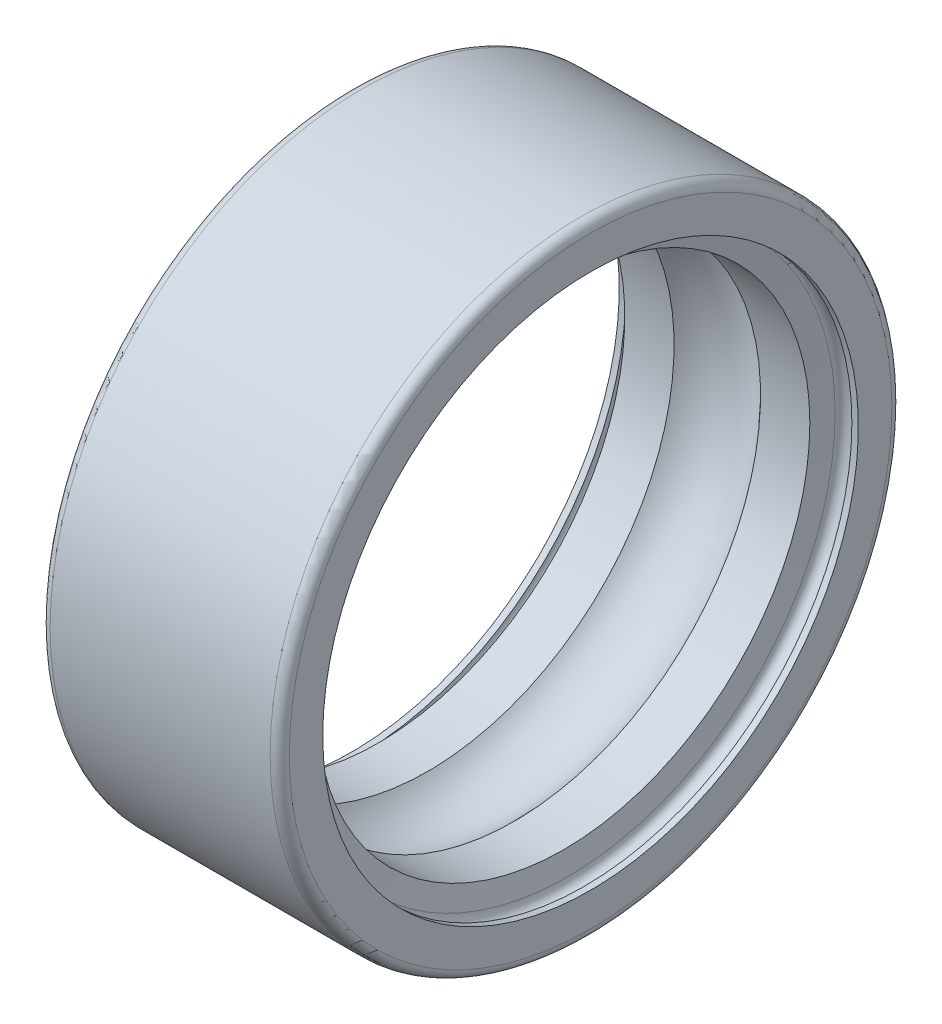
ISO-10303-21;
HEADER;
FILE_DESCRIPTION(('STEP AP214'),'2;1');
FILE_NAME('part.step','',(''),(''),'','','');
FILE_SCHEMA(('AUTOMOTIVE_DESIGN { 1 0 10303 214 1 1 1 1 }'));
ENDSEC;
DATA;
#1=APPLICATION_CONTEXT('core data for automotive mechanical design processes');
#2=APPLICATION_PROTOCOL_DEFINITION('international standard','automotive_design',2000,#1);
#3=PRODUCT_CONTEXT('',#1,'mechanical');
#4=PRODUCT('Part','Part','',(#3));
#5=PRODUCT_RELATED_PRODUCT_CATEGORY('part','',(#4));
#6=PRODUCT_DEFINITION_FORMATION('','',#4);
#7=PRODUCT_DEFINITION_CONTEXT('part definition',#1,'design');
#8=PRODUCT_DEFINITION('design','',#6,#7);
#9=PRODUCT_DEFINITION_SHAPE('','',#8);
#10=(LENGTH_UNIT() NAMED_UNIT(*) SI_UNIT(.MILLI.,.METRE.));
#11=(NAMED_UNIT(*) PLANE_ANGLE_UNIT() SI_UNIT($,.RADIAN.));
#12=(NAMED_UNIT(*) SI_UNIT($,.STERADIAN.) SOLID_ANGLE_UNIT());
#13=UNCERTAINTY_MEASURE_WITH_UNIT(LENGTH_MEASURE(1.E-05),#10,'distance_accuracy_value','');
#14=(GEOMETRIC_REPRESENTATION_CONTEXT(3) GLOBAL_UNCERTAINTY_ASSIGNED_CONTEXT((#13)) GLOBAL_UNIT_ASSIGNED_CONTEXT((#10,
#11,#12)) REPRESENTATION_CONTEXT('',''));
#15=CARTESIAN_POINT('',(0.,0.,0.));
#16=DIRECTION('',(0.,0.,1.));
#17=DIRECTION('',(1.,0.,0.));
#18=AXIS2_PLACEMENT_3D('',#15,#16,#17);
#19=CARTESIAN_POINT('',(2.5,0.,0.));
#20=DIRECTION('',(1.,0.,0.));
#21=DIRECTION('',(0.,0.,-1.));
#22=AXIS2_PLACEMENT_3D('',#19,#20,#21);
#23=TOROIDAL_SURFACE('',#22,4.375,1.1905);
#24=CARTESIAN_POINT('',(3.40369533029667,0.,0.));
#25=DIRECTION('',(-1.,0.,0.));
#26=DIRECTION('',(0.,0.,1.));
#27=AXIS2_PLACEMENT_3D('',#24,#25,#26);
#28=CIRCLE('',#27,5.15);
#29=CARTESIAN_POINT('',(3.40369533029667,0.,5.15));
#30=VERTEX_POINT('',#29);
#31=EDGE_CURVE('E124',#30,#30,#28,.F.);
#32=ORIENTED_EDGE('',*,*,#31,.T.);
#33=EDGE_LOOP('',(#32));
#34=FACE_BOUND('',#33,.T.);
#35=CARTESIAN_POINT('',(1.59630466970333,0.,0.));
#36=DIRECTION('',(-1.,0.,0.));
#37=DIRECTION('',(0.,0.,1.));
#38=AXIS2_PLACEMENT_3D('',#35,#36,#37);
#39=CIRCLE('',#38,5.15);
#40=CARTESIAN_POINT('',(1.59630466970333,0.,5.15));
#41=VERTEX_POINT('',#40);
#42=EDGE_CURVE('E129',#41,#41,#39,.T.);
#43=ORIENTED_EDGE('',*,*,#42,.T.);
#44=EDGE_LOOP('',(#43));
#45=FACE_BOUND('',#44,.T.);
#46=ADVANCED_FACE('F15',(#34,#45),#23,.F.);
#47=CARTESIAN_POINT('',(4.8,0.,0.));
#48=DIRECTION('',(-1.,0.,0.));
#49=DIRECTION('',(0.,0.,1.));
#50=AXIS2_PLACEMENT_3D('',#47,#48,#49);
#51=CYLINDRICAL_SURFACE('',#50,5.15);
#52=CARTESIAN_POINT('',(0.565347141318284,0.,0.));
#53=DIRECTION('',(-1.,0.,0.));
#54=DIRECTION('',(0.,0.,1.));
#55=AXIS2_PLACEMENT_3D('',#52,#53,#54);
#56=CIRCLE('',#55,5.15000000001464);
#57=CARTESIAN_POINT('',(0.565347141318284,0.,5.15000000001464));
#58=VERTEX_POINT('',#57);
#59=EDGE_CURVE('E119',#58,#58,#56,.T.);
#60=ORIENTED_EDGE('',*,*,#59,.T.);
#61=EDGE_LOOP('',(#60));
#62=FACE_BOUND('',#61,.T.);
#63=ORIENTED_EDGE('',*,*,#42,.F.);
#64=EDGE_LOOP('',(#63));
#65=FACE_BOUND('',#64,.T.);
#66=ADVANCED_FACE('F243',(#62,#65),#51,.F.);
#67=CARTESIAN_POINT('',(4.8,0.,0.));
#68=DIRECTION('',(-1.,0.,0.));
#69=DIRECTION('',(0.,0.,1.));
#70=AXIS2_PLACEMENT_3D('',#67,#68,#69);
#71=CYLINDRICAL_SURFACE('',#70,5.15);
#72=ORIENTED_EDGE('',*,*,#31,.F.);
#73=EDGE_LOOP('',(#72));
#74=FACE_BOUND('',#73,.T.);
#75=CARTESIAN_POINT('',(4.43465285867717,0.,0.));
#76=DIRECTION('',(1.,0.,0.));
#77=DIRECTION('',(0.,0.,-1.));
#78=AXIS2_PLACEMENT_3D('',#75,#76,#77);
#79=CIRCLE('',#78,5.15000000001464);
#80=CARTESIAN_POINT('',(4.43465285867717,0.,-5.15000000001464));
#81=VERTEX_POINT('',#80);
#82=EDGE_CURVE('E114',#81,#81,#79,.T.);
#83=ORIENTED_EDGE('',*,*,#82,.T.);
#84=EDGE_LOOP('',(#83));
#85=FACE_BOUND('',#84,.T.);
#86=ADVANCED_FACE('F233',(#74,#85),#71,.F.);
#87=CARTESIAN_POINT('',(0.486000000009312,0.,0.));
#88=DIRECTION('',(-1.,0.,0.));
#89=DIRECTION('',(0.,0.,1.));
#90=AXIS2_PLACEMENT_3D('',#87,#88,#89);
#91=CONICAL_SURFACE('',#90,5.60000000263017,1.39626340261062);
#92=CARTESIAN_POINT('',(0.485999999999999,0.,0.));
#93=DIRECTION('',(1.,0.,0.));
#94=DIRECTION('',(0.,0.,-1.));
#95=AXIS2_PLACEMENT_3D('',#92,#93,#94);
#96=CIRCLE('',#95,5.6000000026077);
#97=CARTESIAN_POINT('',(0.485999999999999,0.,-5.6000000026077));
#98=VERTEX_POINT('',#97);
#99=EDGE_CURVE('E108',#98,#98,#96,.F.);
#100=ORIENTED_EDGE('',*,*,#99,.T.);
#101=EDGE_LOOP('',(#100));
#102=FACE_BOUND('',#101,.T.);
#103=ORIENTED_EDGE('',*,*,#59,.F.);
#104=EDGE_LOOP('',(#103));
#105=FACE_BOUND('',#104,.T.);
#106=ADVANCED_FACE('F167',(#102,#105),#91,.F.);
#107=CARTESIAN_POINT('',(4.51399999998614,0.,0.));
#108=DIRECTION('',(1.,0.,0.));
#109=DIRECTION('',(0.,0.,-1.));
#110=AXIS2_PLACEMENT_3D('',#107,#108,#109);
#111=CONICAL_SURFACE('',#110,5.60000000001537,1.39626340161694);
#112=ORIENTED_EDGE('',*,*,#82,.F.);
#113=EDGE_LOOP('',(#112));
#114=FACE_BOUND('',#113,.T.);
#115=CARTESIAN_POINT('',(4.514,0.,0.));
#116=DIRECTION('',(1.,0.,0.));
#117=DIRECTION('',(0.,0.,-1.));
#118=AXIS2_PLACEMENT_3D('',#115,#116,#117);
#119=CIRCLE('',#118,5.6);
#120=CARTESIAN_POINT('',(4.514,0.,-5.6));
#121=VERTEX_POINT('',#120);
#122=EDGE_CURVE('E104',#121,#121,#119,.T.);
#123=ORIENTED_EDGE('',*,*,#122,.T.);
#124=EDGE_LOOP('',(#123));
#125=FACE_BOUND('',#124,.T.);
#126=ADVANCED_FACE('F161',(#114,#125),#111,.F.);
#127=CARTESIAN_POINT('',(0.310999999999999,0.,0.));
#128=DIRECTION('',(1.,0.,0.));
#129=DIRECTION('',(0.,0.,-1.));
#130=AXIS2_PLACEMENT_3D('',#127,#128,#129);
#131=TOROIDAL_SURFACE('',#130,5.6,0.175);
#132=ORIENTED_EDGE('',*,*,#99,.F.);
#133=EDGE_LOOP('',(#132));
#134=FACE_BOUND('',#133,.T.);
#135=CARTESIAN_POINT('',(0.135999999999999,0.,0.));
#136=DIRECTION('',(-1.,0.,0.));
#137=DIRECTION('',(0.,0.,1.));
#138=AXIS2_PLACEMENT_3D('',#135,#136,#137);
#139=CIRCLE('',#138,5.6);
#140=CARTESIAN_POINT('',(0.135999999999999,0.,5.6));
#141=VERTEX_POINT('',#140);
#142=EDGE_CURVE('E107',#141,#141,#139,.T.);
#143=ORIENTED_EDGE('',*,*,#142,.T.);
#144=EDGE_LOOP('',(#143));
#145=FACE_BOUND('',#144,.T.);
#146=ADVANCED_FACE('F95',(#134,#145),#131,.F.);
#147=CARTESIAN_POINT('',(4.689,0.,0.));
#148=DIRECTION('',(1.,0.,0.));
#149=DIRECTION('',(0.,0.,-1.));
#150=AXIS2_PLACEMENT_3D('',#147,#148,#149);
#151=TOROIDAL_SURFACE('',#150,5.6,0.175);
#152=CARTESIAN_POINT('',(4.864,0.,0.));
#153=DIRECTION('',(-1.,0.,0.));
#154=DIRECTION('',(0.,0.,1.));
#155=AXIS2_PLACEMENT_3D('',#152,#153,#154);
#156=CIRCLE('',#155,5.60000000130385);
#157=CARTESIAN_POINT('',(4.864,0.,5.60000000130385));
#158=VERTEX_POINT('',#157);
#159=EDGE_CURVE('E141',#158,#158,#156,.F.);
#160=ORIENTED_EDGE('',*,*,#159,.T.);
#161=EDGE_LOOP('',(#160));
#162=FACE_BOUND('',#161,.T.);
#163=ORIENTED_EDGE('',*,*,#122,.F.);
#164=EDGE_LOOP('',(#163));
#165=FACE_BOUND('',#164,.T.);
#166=ADVANCED_FACE('F90',(#162,#165),#151,.F.);
#167=CARTESIAN_POINT('',(4.8,0.,0.));
#168=DIRECTION('',(-1.,0.,0.));
#169=DIRECTION('',(0.,0.,1.));
#170=AXIS2_PLACEMENT_3D('',#167,#168,#169);
#171=CYLINDRICAL_SURFACE('',#170,5.6);
#172=CARTESIAN_POINT('',(0.,0.,0.));
#173=DIRECTION('',(-1.,0.,0.));
#174=DIRECTION('',(0.,0.,1.));
#175=AXIS2_PLACEMENT_3D('',#172,#173,#174);
#176=CIRCLE('',#175,5.6);
#177=CARTESIAN_POINT('',(0.,0.,5.6));
#178=VERTEX_POINT('',#177);
#179=EDGE_CURVE('E19',#178,#178,#176,.F.);
#180=ORIENTED_EDGE('',*,*,#179,.F.);
#181=EDGE_LOOP('',(#180));
#182=FACE_BOUND('',#181,.T.);
#183=ORIENTED_EDGE('',*,*,#142,.F.);
#184=EDGE_LOOP('',(#183));
#185=FACE_BOUND('',#184,.T.);
#186=ADVANCED_FACE('F86',(#182,#185),#171,.F.);
#187=CARTESIAN_POINT('',(4.8,0.,0.));
#188=DIRECTION('',(-1.,0.,0.));
#189=DIRECTION('',(0.,0.,1.));
#190=AXIS2_PLACEMENT_3D('',#187,#188,#189);
#191=CYLINDRICAL_SURFACE('',#190,5.60000000130385);
#192=ORIENTED_EDGE('',*,*,#159,.F.);
#193=EDGE_LOOP('',(#192));
#194=FACE_BOUND('',#193,.T.);
#195=CARTESIAN_POINT('',(5.,0.,0.));
#196=DIRECTION('',(-1.,0.,0.));
#197=DIRECTION('',(0.,0.,1.));
#198=AXIS2_PLACEMENT_3D('',#195,#196,#197);
#199=CIRCLE('',#198,5.60000000130385);
#200=CARTESIAN_POINT('',(5.,0.,5.60000000130385));
#201=VERTEX_POINT('',#200);
#202=EDGE_CURVE('E136',#201,#201,#199,.T.);
#203=ORIENTED_EDGE('',*,*,#202,.F.);
#204=EDGE_LOOP('',(#203));
#205=FACE_BOUND('',#204,.T.);
#206=ADVANCED_FACE('F82',(#194,#205),#191,.F.);
#207=CARTESIAN_POINT('',(0.,6.3,0.));
#208=DIRECTION('',(-1.,0.,0.));
#209=DIRECTION('',(0.,0.,1.));
#210=AXIS2_PLACEMENT_3D('',#207,#208,#209);
#211=PLANE('',#210);
#212=CARTESIAN_POINT('',(0.,0.,0.));
#213=DIRECTION('',(1.,0.,0.));
#214=DIRECTION('',(0.,0.,-1.));
#215=AXIS2_PLACEMENT_3D('',#212,#213,#214);
#216=CIRCLE('',#215,6.3);
#217=CARTESIAN_POINT('',(0.,0.,-6.3));
#218=VERTEX_POINT('',#217);
#219=EDGE_CURVE('E66',#218,#218,#216,.T.);
#220=ORIENTED_EDGE('',*,*,#219,.F.);
#221=EDGE_LOOP('',(#220));
#222=FACE_BOUND('',#221,.T.);
#223=ORIENTED_EDGE('',*,*,#179,.T.);
#224=EDGE_LOOP('',(#223));
#225=FACE_BOUND('',#224,.T.);
#226=ADVANCED_FACE('F72',(#222,#225),#211,.T.);
#227=CARTESIAN_POINT('',(5.,5.6,0.));
#228=DIRECTION('',(1.,0.,0.));
#229=DIRECTION('',(0.,0.,-1.));
#230=AXIS2_PLACEMENT_3D('',#227,#228,#229);
#231=PLANE('',#230);
#232=ORIENTED_EDGE('',*,*,#202,.T.);
#233=EDGE_LOOP('',(#232));
#234=FACE_BOUND('',#233,.T.);
#235=CARTESIAN_POINT('',(5.,0.,0.));
#236=DIRECTION('',(-1.,0.,0.));
#237=DIRECTION('',(0.,0.,-1.));
#238=AXIS2_PLACEMENT_3D('',#235,#236,#237);
#239=CIRCLE('',#238,6.29999999999999);
#240=CARTESIAN_POINT('',(5.,0.,-6.29999999999999));
#241=VERTEX_POINT('',#240);
#242=EDGE_CURVE('E28',#241,#241,#239,.T.);
#243=ORIENTED_EDGE('',*,*,#242,.F.);
#244=EDGE_LOOP('',(#243));
#245=FACE_BOUND('',#244,.T.);
#246=ADVANCED_FACE('F81',(#234,#245),#231,.T.);
#247=CARTESIAN_POINT('',(0.200000000000001,0.,0.));
#248=DIRECTION('',(1.,0.,0.));
#249=DIRECTION('',(0.,0.,-1.));
#250=AXIS2_PLACEMENT_3D('',#247,#248,#249);
#251=TOROIDAL_SURFACE('',#250,6.3,0.200000000000001);
#252=CARTESIAN_POINT('',(0.200000000000001,0.,0.));
#253=DIRECTION('',(-1.,0.,0.));
#254=DIRECTION('',(0.,0.,1.));
#255=AXIS2_PLACEMENT_3D('',#252,#253,#254);
#256=CIRCLE('',#255,6.5);
#257=CARTESIAN_POINT('',(0.200000000000001,0.,6.5));
#258=VERTEX_POINT('',#257);
#259=EDGE_CURVE('E23',#258,#258,#256,.F.);
#260=ORIENTED_EDGE('',*,*,#259,.F.);
#261=EDGE_LOOP('',(#260));
#262=FACE_BOUND('',#261,.T.);
#263=ORIENTED_EDGE('',*,*,#219,.T.);
#264=EDGE_LOOP('',(#263));
#265=FACE_BOUND('',#264,.T.);
#266=ADVANCED_FACE('F46',(#262,#265),#251,.T.);
#267=CARTESIAN_POINT('',(4.8,0.,0.));
#268=DIRECTION('',(1.,0.,0.));
#269=DIRECTION('',(0.,0.,-1.));
#270=AXIS2_PLACEMENT_3D('',#267,#268,#269);
#271=TOROIDAL_SURFACE('',#270,6.3,0.200000000000001);
#272=ORIENTED_EDGE('',*,*,#242,.T.);
#273=EDGE_LOOP('',(#272));
#274=FACE_BOUND('',#273,.T.);
#275=CARTESIAN_POINT('',(4.8,0.,0.));
#276=DIRECTION('',(-1.,0.,0.));
#277=DIRECTION('',(0.,0.,1.));
#278=AXIS2_PLACEMENT_3D('',#275,#276,#277);
#279=CIRCLE('',#278,6.5);
#280=CARTESIAN_POINT('',(4.8,0.,6.5));
#281=VERTEX_POINT('',#280);
#282=EDGE_CURVE('E10',#281,#281,#279,.T.);
#283=ORIENTED_EDGE('',*,*,#282,.F.);
#284=EDGE_LOOP('',(#283));
#285=FACE_BOUND('',#284,.T.);
#286=ADVANCED_FACE('F40',(#274,#285),#271,.T.);
#287=CARTESIAN_POINT('',(4.8,0.,0.));
#288=DIRECTION('',(-1.,0.,0.));
#289=DIRECTION('',(0.,0.,1.));
#290=AXIS2_PLACEMENT_3D('',#287,#288,#289);
#291=CYLINDRICAL_SURFACE('',#290,6.5);
#292=ORIENTED_EDGE('',*,*,#282,.T.);
#293=EDGE_LOOP('',(#292));
#294=FACE_BOUND('',#293,.T.);
#295=ORIENTED_EDGE('',*,*,#259,.T.);
#296=EDGE_LOOP('',(#295));
#297=FACE_BOUND('',#296,.T.);
#298=ADVANCED_FACE('F45',(#294,#297),#291,.T.);
#299=CLOSED_SHELL('',(#46,#66,#86,#106,#126,#146,#166,#186,#206,#226,#246,#266,#286,#298));
#300=MANIFOLD_SOLID_BREP('B1',#299);
#301=ADVANCED_BREP_SHAPE_REPRESENTATION('',(#18,#300),#14);
#302=SHAPE_DEFINITION_REPRESENTATION(#9,#301);
ENDSEC;
END-ISO-10303-21;
